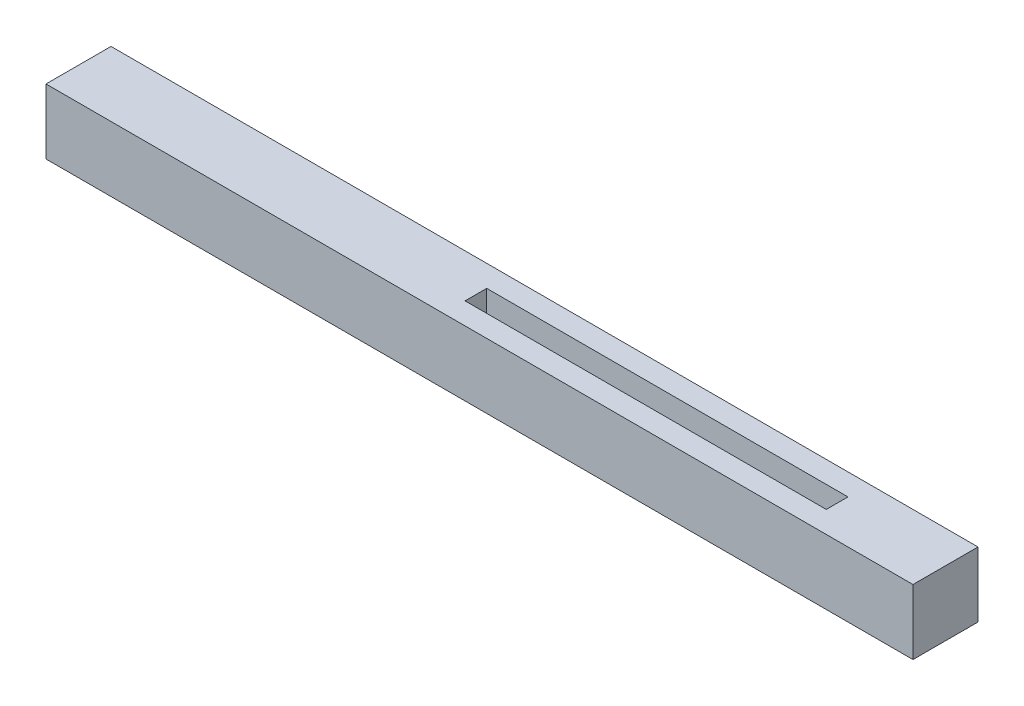
ISO-10303-21;
HEADER;
FILE_DESCRIPTION(('STEP AP214'),'2;1');
FILE_NAME('part.step','',(''),(''),'','','');
FILE_SCHEMA(('AUTOMOTIVE_DESIGN { 1 0 10303 214 1 1 1 1 }'));
ENDSEC;
DATA;
#1=APPLICATION_CONTEXT('core data for automotive mechanical design processes');
#2=APPLICATION_PROTOCOL_DEFINITION('international standard','automotive_design',2000,#1);
#3=PRODUCT_CONTEXT('',#1,'mechanical');
#4=PRODUCT('Part','Part','',(#3));
#5=PRODUCT_RELATED_PRODUCT_CATEGORY('part','',(#4));
#6=PRODUCT_DEFINITION_FORMATION('','',#4);
#7=PRODUCT_DEFINITION_CONTEXT('part definition',#1,'design');
#8=PRODUCT_DEFINITION('design','',#6,#7);
#9=PRODUCT_DEFINITION_SHAPE('','',#8);
#10=(LENGTH_UNIT() NAMED_UNIT(*) SI_UNIT(.MILLI.,.METRE.));
#11=(NAMED_UNIT(*) PLANE_ANGLE_UNIT() SI_UNIT($,.RADIAN.));
#12=(NAMED_UNIT(*) SI_UNIT($,.STERADIAN.) SOLID_ANGLE_UNIT());
#13=UNCERTAINTY_MEASURE_WITH_UNIT(LENGTH_MEASURE(1.E-05),#10,'distance_accuracy_value','');
#14=(GEOMETRIC_REPRESENTATION_CONTEXT(3) GLOBAL_UNCERTAINTY_ASSIGNED_CONTEXT((#13)) GLOBAL_UNIT_ASSIGNED_CONTEXT((#10,
#11,#12)) REPRESENTATION_CONTEXT('',''));
#15=CARTESIAN_POINT('',(0.,0.,0.));
#16=DIRECTION('',(0.,0.,1.));
#17=DIRECTION('',(1.,0.,0.));
#18=AXIS2_PLACEMENT_3D('',#15,#16,#17);
#19=CARTESIAN_POINT('',(0.,9.,0.));
#20=DIRECTION('',(0.,1.,0.));
#21=DIRECTION('',(0.,0.,1.));
#22=AXIS2_PLACEMENT_3D('',#19,#20,#21);
#23=PLANE('',#22);
#24=DIRECTION('',(0.,0.,1.));
#25=VECTOR('',#24,1.);
#26=CARTESIAN_POINT('',(-60.2409408862161,9.,-18.3626495834325));
#27=LINE('',#26,#25);
#28=CARTESIAN_POINT('',(-60.2409408862161,9.,-18.3626495834325));
#29=VERTEX_POINT('',#28);
#30=CARTESIAN_POINT('',(-60.2409408862161,9.,-9.36264958343255));
#31=VERTEX_POINT('',#30);
#32=EDGE_CURVE('E153',#29,#31,#27,.T.);
#33=ORIENTED_EDGE('',*,*,#32,.T.);
#34=DIRECTION('',(1.,0.,0.));
#35=VECTOR('',#34,1.);
#36=CARTESIAN_POINT('',(-60.2409408862161,9.,-9.36264958343255));
#37=LINE('',#36,#35);
#38=CARTESIAN_POINT('',(59.7590591137839,9.,-9.36264958343263));
#39=VERTEX_POINT('',#38);
#40=EDGE_CURVE('E157',#31,#39,#37,.T.);
#41=ORIENTED_EDGE('',*,*,#40,.T.);
#42=DIRECTION('',(0.,0.,-1.));
#43=VECTOR('',#42,1.);
#44=CARTESIAN_POINT('',(59.7590591137839,9.,-18.3626495834325));
#45=LINE('',#44,#43);
#46=CARTESIAN_POINT('',(59.7590591137839,9.,-18.3626495834325));
#47=VERTEX_POINT('',#46);
#48=EDGE_CURVE('E161',#39,#47,#45,.T.);
#49=ORIENTED_EDGE('',*,*,#48,.T.);
#50=DIRECTION('',(-1.,0.,0.));
#51=VECTOR('',#50,1.);
#52=CARTESIAN_POINT('',(-60.2409408862161,9.,-18.3626495834325));
#53=LINE('',#52,#51);
#54=EDGE_CURVE('E164',#47,#29,#53,.T.);
#55=ORIENTED_EDGE('',*,*,#54,.T.);
#56=EDGE_LOOP('',(#33,#41,#49,#55));
#57=FACE_BOUND('',#56,.T.);
#58=DIRECTION('',(1.,0.,0.));
#59=VECTOR('',#58,1.);
#60=CARTESIAN_POINT('',(-5.2409408862161,9.,-12.3626495834325));
#61=LINE('',#60,#59);
#62=CARTESIAN_POINT('',(-5.2409408862161,9.,-12.3626495834325));
#63=VERTEX_POINT('',#62);
#64=CARTESIAN_POINT('',(44.7590591137839,9.,-12.3626495834325));
#65=VERTEX_POINT('',#64);
#66=EDGE_CURVE('E114',#63,#65,#61,.T.);
#67=ORIENTED_EDGE('',*,*,#66,.F.);
#68=DIRECTION('',(0.,0.,1.));
#69=VECTOR('',#68,1.);
#70=CARTESIAN_POINT('',(-5.2409408862161,9.,-15.3626495834325));
#71=LINE('',#70,#69);
#72=CARTESIAN_POINT('',(-5.2409408862161,9.,-15.3626495834325));
#73=VERTEX_POINT('',#72);
#74=EDGE_CURVE('E105',#73,#63,#71,.T.);
#75=ORIENTED_EDGE('',*,*,#74,.F.);
#76=DIRECTION('',(-1.,0.,0.));
#77=VECTOR('',#76,1.);
#78=CARTESIAN_POINT('',(-5.2409408862161,9.,-15.3626495834325));
#79=LINE('',#78,#77);
#80=CARTESIAN_POINT('',(44.7590591137839,9.,-15.3626495834325));
#81=VERTEX_POINT('',#80);
#82=EDGE_CURVE('E131',#81,#73,#79,.T.);
#83=ORIENTED_EDGE('',*,*,#82,.F.);
#84=DIRECTION('',(0.,0.,-1.));
#85=VECTOR('',#84,1.);
#86=CARTESIAN_POINT('',(44.7590591137839,9.,-15.3626495834325));
#87=LINE('',#86,#85);
#88=EDGE_CURVE('E127',#65,#81,#87,.T.);
#89=ORIENTED_EDGE('',*,*,#88,.F.);
#90=EDGE_LOOP('',(#67,#75,#83,#89));
#91=FACE_BOUND('',#90,.T.);
#92=ADVANCED_FACE('F39',(#57,#91),#23,.T.);
#93=CARTESIAN_POINT('',(0.,0.,0.));
#94=DIRECTION('',(0.,1.,0.));
#95=DIRECTION('',(0.,0.,1.));
#96=AXIS2_PLACEMENT_3D('',#93,#94,#95);
#97=PLANE('',#96);
#98=DIRECTION('',(0.,0.,1.));
#99=VECTOR('',#98,1.);
#100=CARTESIAN_POINT('',(-60.2409408862161,0.,-18.3626495834325));
#101=LINE('',#100,#99);
#102=CARTESIAN_POINT('',(-60.2409408862161,0.,-18.3626495834325));
#103=VERTEX_POINT('',#102);
#104=CARTESIAN_POINT('',(-60.2409408862161,0.,-9.36264958343255));
#105=VERTEX_POINT('',#104);
#106=EDGE_CURVE('E123',#103,#105,#101,.T.);
#107=ORIENTED_EDGE('',*,*,#106,.F.);
#108=DIRECTION('',(-1.,0.,0.));
#109=VECTOR('',#108,1.);
#110=CARTESIAN_POINT('',(-60.2409408862161,0.,-18.3626495834325));
#111=LINE('',#110,#109);
#112=CARTESIAN_POINT('',(59.7590591137839,0.,-18.3626495834325));
#113=VERTEX_POINT('',#112);
#114=EDGE_CURVE('E158',#113,#103,#111,.T.);
#115=ORIENTED_EDGE('',*,*,#114,.F.);
#116=DIRECTION('',(0.,0.,-1.));
#117=VECTOR('',#116,1.);
#118=CARTESIAN_POINT('',(59.7590591137839,0.,-18.3626495834325));
#119=LINE('',#118,#117);
#120=CARTESIAN_POINT('',(59.7590591137839,0.,-9.36264958343263));
#121=VERTEX_POINT('',#120);
#122=EDGE_CURVE('E174',#121,#113,#119,.T.);
#123=ORIENTED_EDGE('',*,*,#122,.F.);
#124=DIRECTION('',(1.,0.,0.));
#125=VECTOR('',#124,1.);
#126=CARTESIAN_POINT('',(-60.2409408862161,0.,-9.36264958343255));
#127=LINE('',#126,#125);
#128=EDGE_CURVE('E171',#105,#121,#127,.T.);
#129=ORIENTED_EDGE('',*,*,#128,.F.);
#130=EDGE_LOOP('',(#107,#115,#123,#129));
#131=FACE_BOUND('',#130,.T.);
#132=DIRECTION('',(0.,0.,1.));
#133=VECTOR('',#132,1.);
#134=CARTESIAN_POINT('',(-5.2409408862161,0.,-15.3626495834325));
#135=LINE('',#134,#133);
#136=CARTESIAN_POINT('',(-5.2409408862161,0.,-15.3626495834325));
#137=VERTEX_POINT('',#136);
#138=CARTESIAN_POINT('',(-5.2409408862161,0.,-12.3626495834325));
#139=VERTEX_POINT('',#138);
#140=EDGE_CURVE('E63',#137,#139,#135,.T.);
#141=ORIENTED_EDGE('',*,*,#140,.T.);
#142=DIRECTION('',(1.,0.,0.));
#143=VECTOR('',#142,1.);
#144=CARTESIAN_POINT('',(-5.2409408862161,0.,-12.3626495834325));
#145=LINE('',#144,#143);
#146=CARTESIAN_POINT('',(44.7590591137839,0.,-12.3626495834325));
#147=VERTEX_POINT('',#146);
#148=EDGE_CURVE('E121',#139,#147,#145,.T.);
#149=ORIENTED_EDGE('',*,*,#148,.T.);
#150=DIRECTION('',(0.,0.,-1.));
#151=VECTOR('',#150,1.);
#152=CARTESIAN_POINT('',(44.7590591137839,0.,-15.3626495834325));
#153=LINE('',#152,#151);
#154=CARTESIAN_POINT('',(44.7590591137839,0.,-15.3626495834325));
#155=VERTEX_POINT('',#154);
#156=EDGE_CURVE('E140',#147,#155,#153,.T.);
#157=ORIENTED_EDGE('',*,*,#156,.T.);
#158=DIRECTION('',(-1.,0.,0.));
#159=VECTOR('',#158,1.);
#160=CARTESIAN_POINT('',(-5.2409408862161,0.,-15.3626495834325));
#161=LINE('',#160,#159);
#162=EDGE_CURVE('E115',#155,#137,#161,.T.);
#163=ORIENTED_EDGE('',*,*,#162,.T.);
#164=EDGE_LOOP('',(#141,#149,#157,#163));
#165=FACE_BOUND('',#164,.T.);
#166=ADVANCED_FACE('F197',(#131,#165),#97,.F.);
#167=CARTESIAN_POINT('',(-60.2409408862161,9.,-18.3626495834325));
#168=DIRECTION('',(1.,0.,0.));
#169=DIRECTION('',(0.,0.,-1.));
#170=AXIS2_PLACEMENT_3D('',#167,#168,#169);
#171=PLANE('',#170);
#172=ORIENTED_EDGE('',*,*,#106,.T.);
#173=DIRECTION('',(0.,-1.,0.));
#174=VECTOR('',#173,1.);
#175=CARTESIAN_POINT('',(-60.2409408862161,9.,-9.36264958343255));
#176=LINE('',#175,#174);
#177=EDGE_CURVE('E11',#31,#105,#176,.T.);
#178=ORIENTED_EDGE('',*,*,#177,.F.);
#179=ORIENTED_EDGE('',*,*,#32,.F.);
#180=DIRECTION('',(0.,-1.,0.));
#181=VECTOR('',#180,1.);
#182=CARTESIAN_POINT('',(-60.2409408862161,9.,-18.3626495834325));
#183=LINE('',#182,#181);
#184=EDGE_CURVE('E167',#29,#103,#183,.T.);
#185=ORIENTED_EDGE('',*,*,#184,.T.);
#186=EDGE_LOOP('',(#172,#178,#179,#185));
#187=FACE_BOUND('',#186,.T.);
#188=ADVANCED_FACE('F41',(#187),#171,.F.);
#189=CARTESIAN_POINT('',(-60.2409408862161,9.,-9.36264958343255));
#190=DIRECTION('',(0.,0.,-1.));
#191=DIRECTION('',(-1.,0.,0.));
#192=AXIS2_PLACEMENT_3D('',#189,#190,#191);
#193=PLANE('',#192);
#194=ORIENTED_EDGE('',*,*,#128,.T.);
#195=DIRECTION('',(0.,-1.,0.));
#196=VECTOR('',#195,1.);
#197=CARTESIAN_POINT('',(59.7590591137839,9.,-9.36264958343263));
#198=LINE('',#197,#196);
#199=EDGE_CURVE('E48',#39,#121,#198,.T.);
#200=ORIENTED_EDGE('',*,*,#199,.F.);
#201=ORIENTED_EDGE('',*,*,#40,.F.);
#202=ORIENTED_EDGE('',*,*,#177,.T.);
#203=EDGE_LOOP('',(#194,#200,#201,#202));
#204=FACE_BOUND('',#203,.T.);
#205=ADVANCED_FACE('F207',(#204),#193,.F.);
#206=CARTESIAN_POINT('',(59.7590591137839,9.,-18.3626495834325));
#207=DIRECTION('',(-1.,0.,0.));
#208=DIRECTION('',(0.,0.,1.));
#209=AXIS2_PLACEMENT_3D('',#206,#207,#208);
#210=PLANE('',#209);
#211=ORIENTED_EDGE('',*,*,#122,.T.);
#212=DIRECTION('',(0.,-1.,0.));
#213=VECTOR('',#212,1.);
#214=CARTESIAN_POINT('',(59.7590591137839,9.,-18.3626495834325));
#215=LINE('',#214,#213);
#216=EDGE_CURVE('E182',#47,#113,#215,.T.);
#217=ORIENTED_EDGE('',*,*,#216,.F.);
#218=ORIENTED_EDGE('',*,*,#48,.F.);
#219=ORIENTED_EDGE('',*,*,#199,.T.);
#220=EDGE_LOOP('',(#211,#217,#218,#219));
#221=FACE_BOUND('',#220,.T.);
#222=ADVANCED_FACE('F191',(#221),#210,.F.);
#223=CARTESIAN_POINT('',(-60.2409408862161,9.,-18.3626495834325));
#224=DIRECTION('',(0.,0.,1.));
#225=DIRECTION('',(1.,0.,0.));
#226=AXIS2_PLACEMENT_3D('',#223,#224,#225);
#227=PLANE('',#226);
#228=ORIENTED_EDGE('',*,*,#114,.T.);
#229=ORIENTED_EDGE('',*,*,#184,.F.);
#230=ORIENTED_EDGE('',*,*,#54,.F.);
#231=ORIENTED_EDGE('',*,*,#216,.T.);
#232=EDGE_LOOP('',(#228,#229,#230,#231));
#233=FACE_BOUND('',#232,.T.);
#234=ADVANCED_FACE('F201',(#233),#227,.F.);
#235=CARTESIAN_POINT('',(-5.2409408862161,9.,-15.3626495834325));
#236=DIRECTION('',(1.,0.,0.));
#237=DIRECTION('',(0.,0.,-1.));
#238=AXIS2_PLACEMENT_3D('',#235,#236,#237);
#239=PLANE('',#238);
#240=ORIENTED_EDGE('',*,*,#140,.F.);
#241=DIRECTION('',(0.,-1.,0.));
#242=VECTOR('',#241,1.);
#243=CARTESIAN_POINT('',(-5.2409408862161,9.,-15.3626495834325));
#244=LINE('',#243,#242);
#245=EDGE_CURVE('E109',#73,#137,#244,.T.);
#246=ORIENTED_EDGE('',*,*,#245,.F.);
#247=ORIENTED_EDGE('',*,*,#74,.T.);
#248=DIRECTION('',(0.,-1.,0.));
#249=VECTOR('',#248,1.);
#250=CARTESIAN_POINT('',(-5.2409408862161,9.,-12.3626495834325));
#251=LINE('',#250,#249);
#252=EDGE_CURVE('E108',#63,#139,#251,.T.);
#253=ORIENTED_EDGE('',*,*,#252,.T.);
#254=EDGE_LOOP('',(#240,#246,#247,#253));
#255=FACE_BOUND('',#254,.T.);
#256=ADVANCED_FACE('F107',(#255),#239,.T.);
#257=CARTESIAN_POINT('',(-5.2409408862161,9.,-12.3626495834325));
#258=DIRECTION('',(0.,0.,-1.));
#259=DIRECTION('',(-1.,0.,0.));
#260=AXIS2_PLACEMENT_3D('',#257,#258,#259);
#261=PLANE('',#260);
#262=ORIENTED_EDGE('',*,*,#148,.F.);
#263=ORIENTED_EDGE('',*,*,#252,.F.);
#264=ORIENTED_EDGE('',*,*,#66,.T.);
#265=DIRECTION('',(0.,-1.,0.));
#266=VECTOR('',#265,1.);
#267=CARTESIAN_POINT('',(44.7590591137839,9.,-12.3626495834325));
#268=LINE('',#267,#266);
#269=EDGE_CURVE('E124',#65,#147,#268,.T.);
#270=ORIENTED_EDGE('',*,*,#269,.T.);
#271=EDGE_LOOP('',(#262,#263,#264,#270));
#272=FACE_BOUND('',#271,.T.);
#273=ADVANCED_FACE('F118',(#272),#261,.T.);
#274=CARTESIAN_POINT('',(44.7590591137839,9.,-15.3626495834325));
#275=DIRECTION('',(-1.,0.,0.));
#276=DIRECTION('',(0.,0.,1.));
#277=AXIS2_PLACEMENT_3D('',#274,#275,#276);
#278=PLANE('',#277);
#279=ORIENTED_EDGE('',*,*,#156,.F.);
#280=ORIENTED_EDGE('',*,*,#269,.F.);
#281=ORIENTED_EDGE('',*,*,#88,.T.);
#282=DIRECTION('',(0.,-1.,0.));
#283=VECTOR('',#282,1.);
#284=CARTESIAN_POINT('',(44.7590591137839,9.,-15.3626495834325));
#285=LINE('',#284,#283);
#286=EDGE_CURVE('E55',#81,#155,#285,.T.);
#287=ORIENTED_EDGE('',*,*,#286,.T.);
#288=EDGE_LOOP('',(#279,#280,#281,#287));
#289=FACE_BOUND('',#288,.T.);
#290=ADVANCED_FACE('F230',(#289),#278,.T.);
#291=CARTESIAN_POINT('',(-5.2409408862161,9.,-15.3626495834325));
#292=DIRECTION('',(0.,0.,1.));
#293=DIRECTION('',(1.,0.,0.));
#294=AXIS2_PLACEMENT_3D('',#291,#292,#293);
#295=PLANE('',#294);
#296=ORIENTED_EDGE('',*,*,#162,.F.);
#297=ORIENTED_EDGE('',*,*,#286,.F.);
#298=ORIENTED_EDGE('',*,*,#82,.T.);
#299=ORIENTED_EDGE('',*,*,#245,.T.);
#300=EDGE_LOOP('',(#296,#297,#298,#299));
#301=FACE_BOUND('',#300,.T.);
#302=ADVANCED_FACE('F234',(#301),#295,.T.);
#303=CLOSED_SHELL('',(#92,#166,#188,#205,#222,#234,#256,#273,#290,#302));
#304=MANIFOLD_SOLID_BREP('B2',#303);
#305=ADVANCED_BREP_SHAPE_REPRESENTATION('',(#18,#304),#14);
#306=SHAPE_DEFINITION_REPRESENTATION(#9,#305);
ENDSEC;
END-ISO-10303-21;
